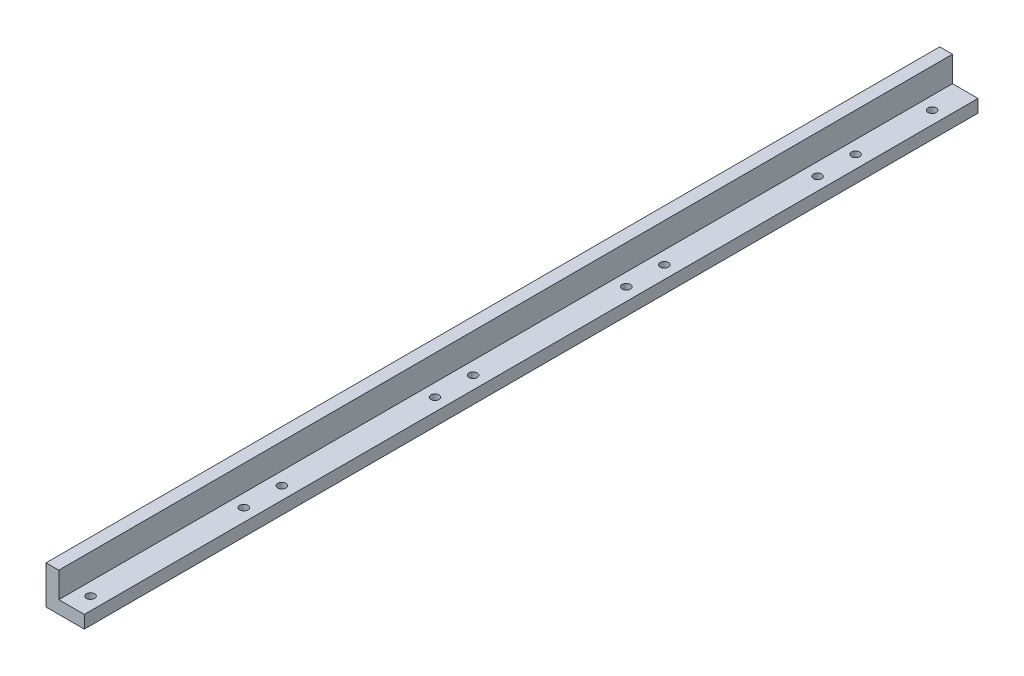
ISO-10303-21;
HEADER;
FILE_DESCRIPTION(('STEP AP214'),'2;1');
FILE_NAME('part.step','',(''),(''),'','','');
FILE_SCHEMA(('AUTOMOTIVE_DESIGN { 1 0 10303 214 1 1 1 1 }'));
ENDSEC;
DATA;
#1=APPLICATION_CONTEXT('core data for automotive mechanical design processes');
#2=APPLICATION_PROTOCOL_DEFINITION('international standard','automotive_design',2000,#1);
#3=PRODUCT_CONTEXT('',#1,'mechanical');
#4=PRODUCT('Part','Part','',(#3));
#5=PRODUCT_RELATED_PRODUCT_CATEGORY('part','',(#4));
#6=PRODUCT_DEFINITION_FORMATION('','',#4);
#7=PRODUCT_DEFINITION_CONTEXT('part definition',#1,'design');
#8=PRODUCT_DEFINITION('design','',#6,#7);
#9=PRODUCT_DEFINITION_SHAPE('','',#8);
#10=(LENGTH_UNIT() NAMED_UNIT(*) SI_UNIT(.MILLI.,.METRE.));
#11=(NAMED_UNIT(*) PLANE_ANGLE_UNIT() SI_UNIT($,.RADIAN.));
#12=(NAMED_UNIT(*) SI_UNIT($,.STERADIAN.) SOLID_ANGLE_UNIT());
#13=UNCERTAINTY_MEASURE_WITH_UNIT(LENGTH_MEASURE(1.E-05),#10,'distance_accuracy_value','');
#14=(GEOMETRIC_REPRESENTATION_CONTEXT(3) GLOBAL_UNCERTAINTY_ASSIGNED_CONTEXT((#13)) GLOBAL_UNIT_ASSIGNED_CONTEXT((#10,
#11,#12)) REPRESENTATION_CONTEXT('',''));
#15=CARTESIAN_POINT('',(0.,0.,0.));
#16=DIRECTION('',(0.,0.,1.));
#17=DIRECTION('',(1.,0.,0.));
#18=AXIS2_PLACEMENT_3D('',#15,#16,#17);
#19=CARTESIAN_POINT('',(15.,0.,350.));
#20=DIRECTION('',(0.,1.,0.));
#21=DIRECTION('',(-1.,0.,0.));
#22=AXIS2_PLACEMENT_3D('',#19,#20,#21);
#23=PLANE('',#22);
#24=CARTESIAN_POINT('',(10.0000000000001,0.,207.65));
#25=DIRECTION('',(0.,-1.,0.));
#26=DIRECTION('',(0.,0.,-1.));
#27=AXIS2_PLACEMENT_3D('',#24,#25,#26);
#28=CIRCLE('',#27,1.6);
#29=CARTESIAN_POINT('',(10.0000000000001,0.,206.05));
#30=VERTEX_POINT('',#29);
#31=EDGE_CURVE('E193',#30,#30,#28,.T.);
#32=ORIENTED_EDGE('',*,*,#31,.F.);
#33=EDGE_LOOP('',(#32));
#34=FACE_BOUND('',#33,.T.);
#35=CARTESIAN_POINT('',(10.,0.,267.65));
#36=DIRECTION('',(0.,-1.,0.));
#37=DIRECTION('',(0.,0.,-1.));
#38=AXIS2_PLACEMENT_3D('',#35,#36,#37);
#39=CIRCLE('',#38,1.6);
#40=CARTESIAN_POINT('',(10.,0.,266.05));
#41=VERTEX_POINT('',#40);
#42=EDGE_CURVE('E199',#41,#41,#39,.T.);
#43=ORIENTED_EDGE('',*,*,#42,.F.);
#44=EDGE_LOOP('',(#43));
#45=FACE_BOUND('',#44,.T.);
#46=DIRECTION('',(1.,0.,0.));
#47=VECTOR('',#46,1.);
#48=CARTESIAN_POINT('',(15.,0.,0.));
#49=LINE('',#48,#47);
#50=CARTESIAN_POINT('',(0.,0.,0.));
#51=VERTEX_POINT('',#50);
#52=CARTESIAN_POINT('',(15.,0.,0.));
#53=VERTEX_POINT('',#52);
#54=EDGE_CURVE('E122',#51,#53,#49,.T.);
#55=ORIENTED_EDGE('',*,*,#54,.T.);
#56=DIRECTION('',(0.,0.,-1.));
#57=VECTOR('',#56,1.);
#58=CARTESIAN_POINT('',(15.,0.,350.));
#59=LINE('',#58,#57);
#60=CARTESIAN_POINT('',(15.,0.,350.));
#61=VERTEX_POINT('',#60);
#62=EDGE_CURVE('E140',#61,#53,#59,.T.);
#63=ORIENTED_EDGE('',*,*,#62,.F.);
#64=DIRECTION('',(1.,0.,0.));
#65=VECTOR('',#64,1.);
#66=CARTESIAN_POINT('',(15.,0.,350.));
#67=LINE('',#66,#65);
#68=CARTESIAN_POINT('',(0.,0.,350.));
#69=VERTEX_POINT('',#68);
#70=EDGE_CURVE('E133',#69,#61,#67,.T.);
#71=ORIENTED_EDGE('',*,*,#70,.F.);
#72=DIRECTION('',(0.,0.,-1.));
#73=VECTOR('',#72,1.);
#74=CARTESIAN_POINT('',(0.,0.,350.));
#75=LINE('',#74,#73);
#76=EDGE_CURVE('E118',#69,#51,#75,.T.);
#77=ORIENTED_EDGE('',*,*,#76,.T.);
#78=EDGE_LOOP('',(#55,#63,#71,#77));
#79=FACE_BOUND('',#78,.T.);
#80=CARTESIAN_POINT('',(10.,0.,282.55));
#81=DIRECTION('',(0.,-1.,0.));
#82=DIRECTION('',(0.,0.,-1.));
#83=AXIS2_PLACEMENT_3D('',#80,#81,#82);
#84=CIRCLE('',#83,1.6);
#85=CARTESIAN_POINT('',(10.,0.,280.95));
#86=VERTEX_POINT('',#85);
#87=EDGE_CURVE('E208',#86,#86,#84,.T.);
#88=ORIENTED_EDGE('',*,*,#87,.F.);
#89=EDGE_LOOP('',(#88));
#90=FACE_BOUND('',#89,.T.);
#91=CARTESIAN_POINT('',(10.,0.,342.55));
#92=DIRECTION('',(0.,-1.,0.));
#93=DIRECTION('',(0.,0.,-1.));
#94=AXIS2_PLACEMENT_3D('',#91,#92,#93);
#95=CIRCLE('',#94,1.6);
#96=CARTESIAN_POINT('',(10.,0.,340.95));
#97=VERTEX_POINT('',#96);
#98=EDGE_CURVE('E202',#97,#97,#95,.T.);
#99=ORIENTED_EDGE('',*,*,#98,.F.);
#100=EDGE_LOOP('',(#99));
#101=FACE_BOUND('',#100,.T.);
#102=CARTESIAN_POINT('',(10.0000000000001,0.,192.75));
#103=DIRECTION('',(0.,-1.,0.));
#104=DIRECTION('',(0.,0.,-1.));
#105=AXIS2_PLACEMENT_3D('',#102,#103,#104);
#106=CIRCLE('',#105,1.6);
#107=CARTESIAN_POINT('',(10.0000000000001,0.,191.15));
#108=VERTEX_POINT('',#107);
#109=EDGE_CURVE('E145',#108,#108,#106,.T.);
#110=ORIENTED_EDGE('',*,*,#109,.F.);
#111=EDGE_LOOP('',(#110));
#112=FACE_BOUND('',#111,.T.);
#113=CARTESIAN_POINT('',(10.0000000000001,0.,117.85));
#114=DIRECTION('',(0.,-1.,0.));
#115=DIRECTION('',(0.,0.,-1.));
#116=AXIS2_PLACEMENT_3D('',#113,#114,#115);
#117=CIRCLE('',#116,1.6);
#118=CARTESIAN_POINT('',(10.0000000000001,0.,116.25));
#119=VERTEX_POINT('',#118);
#120=EDGE_CURVE('E151',#119,#119,#117,.T.);
#121=ORIENTED_EDGE('',*,*,#120,.F.);
#122=EDGE_LOOP('',(#121));
#123=FACE_BOUND('',#122,.T.);
#124=CARTESIAN_POINT('',(10.0000000000001,0.,132.75));
#125=DIRECTION('',(0.,-1.,0.));
#126=DIRECTION('',(0.,0.,-1.));
#127=AXIS2_PLACEMENT_3D('',#124,#125,#126);
#128=CIRCLE('',#127,1.6);
#129=CARTESIAN_POINT('',(10.0000000000001,0.,131.15));
#130=VERTEX_POINT('',#129);
#131=EDGE_CURVE('E157',#130,#130,#128,.T.);
#132=ORIENTED_EDGE('',*,*,#131,.F.);
#133=EDGE_LOOP('',(#132));
#134=FACE_BOUND('',#133,.T.);
#135=CARTESIAN_POINT('',(10.0000000000001,0.,57.85));
#136=DIRECTION('',(0.,-1.,0.));
#137=DIRECTION('',(0.,0.,-1.));
#138=AXIS2_PLACEMENT_3D('',#135,#136,#137);
#139=CIRCLE('',#138,1.6);
#140=CARTESIAN_POINT('',(10.0000000000001,0.,56.25));
#141=VERTEX_POINT('',#140);
#142=EDGE_CURVE('E11',#141,#141,#139,.T.);
#143=ORIENTED_EDGE('',*,*,#142,.F.);
#144=EDGE_LOOP('',(#143));
#145=FACE_BOUND('',#144,.T.);
#146=CARTESIAN_POINT('',(10.0000000000001,0.,12.95));
#147=DIRECTION('',(0.,-1.,0.));
#148=DIRECTION('',(0.,0.,-1.));
#149=AXIS2_PLACEMENT_3D('',#146,#147,#148);
#150=CIRCLE('',#149,1.59999999999999);
#151=CARTESIAN_POINT('',(10.0000000000001,0.,11.35));
#152=VERTEX_POINT('',#151);
#153=EDGE_CURVE('E176',#152,#152,#150,.T.);
#154=ORIENTED_EDGE('',*,*,#153,.F.);
#155=EDGE_LOOP('',(#154));
#156=FACE_BOUND('',#155,.T.);
#157=CARTESIAN_POINT('',(10.0000000000001,0.,42.95));
#158=DIRECTION('',(0.,-1.,0.));
#159=DIRECTION('',(0.,0.,-1.));
#160=AXIS2_PLACEMENT_3D('',#157,#158,#159);
#161=CIRCLE('',#160,1.59999999999999);
#162=CARTESIAN_POINT('',(10.0000000000001,0.,41.35));
#163=VERTEX_POINT('',#162);
#164=EDGE_CURVE('E179',#163,#163,#161,.T.);
#165=ORIENTED_EDGE('',*,*,#164,.F.);
#166=EDGE_LOOP('',(#165));
#167=FACE_BOUND('',#166,.T.);
#168=ADVANCED_FACE('F36',(#34,#45,#79,#90,#101,#112,#123,#134,#145,#156,#167),#23,.F.);
#169=CARTESIAN_POINT('',(10.0000000000001,0.,57.85));
#170=DIRECTION('',(0.,-1.,0.));
#171=DIRECTION('',(0.,0.,-1.));
#172=AXIS2_PLACEMENT_3D('',#169,#170,#171);
#173=CYLINDRICAL_SURFACE('',#172,1.6);
#174=CARTESIAN_POINT('',(10.0000000000001,5.,57.85));
#175=DIRECTION('',(0.,-1.,0.));
#176=DIRECTION('',(0.,0.,-1.));
#177=AXIS2_PLACEMENT_3D('',#174,#175,#176);
#178=CIRCLE('',#177,1.6);
#179=CARTESIAN_POINT('',(10.0000000000001,5.,56.25));
#180=VERTEX_POINT('',#179);
#181=EDGE_CURVE('E45',#180,#180,#178,.T.);
#182=ORIENTED_EDGE('',*,*,#181,.F.);
#183=EDGE_LOOP('',(#182));
#184=FACE_BOUND('',#183,.T.);
#185=ORIENTED_EDGE('',*,*,#142,.T.);
#186=EDGE_LOOP('',(#185));
#187=FACE_BOUND('',#186,.T.);
#188=ADVANCED_FACE('F38',(#184,#187),#173,.F.);
#189=CARTESIAN_POINT('',(10.0000000000001,0.,132.75));
#190=DIRECTION('',(0.,-1.,0.));
#191=DIRECTION('',(0.,0.,-1.));
#192=AXIS2_PLACEMENT_3D('',#189,#190,#191);
#193=CYLINDRICAL_SURFACE('',#192,1.6);
#194=CARTESIAN_POINT('',(10.0000000000001,5.,132.75));
#195=DIRECTION('',(0.,-1.,0.));
#196=DIRECTION('',(0.,0.,-1.));
#197=AXIS2_PLACEMENT_3D('',#194,#195,#196);
#198=CIRCLE('',#197,1.6);
#199=CARTESIAN_POINT('',(10.0000000000001,5.,131.15));
#200=VERTEX_POINT('',#199);
#201=EDGE_CURVE('E154',#200,#200,#198,.T.);
#202=ORIENTED_EDGE('',*,*,#201,.F.);
#203=EDGE_LOOP('',(#202));
#204=FACE_BOUND('',#203,.T.);
#205=ORIENTED_EDGE('',*,*,#131,.T.);
#206=EDGE_LOOP('',(#205));
#207=FACE_BOUND('',#206,.T.);
#208=ADVANCED_FACE('F166',(#204,#207),#193,.F.);
#209=CARTESIAN_POINT('',(10.0000000000001,0.,117.85));
#210=DIRECTION('',(0.,-1.,0.));
#211=DIRECTION('',(0.,0.,-1.));
#212=AXIS2_PLACEMENT_3D('',#209,#210,#211);
#213=CYLINDRICAL_SURFACE('',#212,1.6);
#214=CARTESIAN_POINT('',(10.0000000000001,5.,117.85));
#215=DIRECTION('',(0.,-1.,0.));
#216=DIRECTION('',(0.,0.,-1.));
#217=AXIS2_PLACEMENT_3D('',#214,#215,#216);
#218=CIRCLE('',#217,1.6);
#219=CARTESIAN_POINT('',(10.0000000000001,5.,116.25));
#220=VERTEX_POINT('',#219);
#221=EDGE_CURVE('E148',#220,#220,#218,.T.);
#222=ORIENTED_EDGE('',*,*,#221,.F.);
#223=EDGE_LOOP('',(#222));
#224=FACE_BOUND('',#223,.T.);
#225=ORIENTED_EDGE('',*,*,#120,.T.);
#226=EDGE_LOOP('',(#225));
#227=FACE_BOUND('',#226,.T.);
#228=ADVANCED_FACE('F246',(#224,#227),#213,.F.);
#229=CARTESIAN_POINT('',(10.0000000000001,0.,192.75));
#230=DIRECTION('',(0.,-1.,0.));
#231=DIRECTION('',(0.,0.,-1.));
#232=AXIS2_PLACEMENT_3D('',#229,#230,#231);
#233=CYLINDRICAL_SURFACE('',#232,1.6);
#234=CARTESIAN_POINT('',(10.0000000000001,5.,192.75));
#235=DIRECTION('',(0.,-1.,0.));
#236=DIRECTION('',(0.,0.,-1.));
#237=AXIS2_PLACEMENT_3D('',#234,#235,#236);
#238=CIRCLE('',#237,1.6);
#239=CARTESIAN_POINT('',(10.0000000000001,5.,191.15));
#240=VERTEX_POINT('',#239);
#241=EDGE_CURVE('E142',#240,#240,#238,.T.);
#242=ORIENTED_EDGE('',*,*,#241,.F.);
#243=EDGE_LOOP('',(#242));
#244=FACE_BOUND('',#243,.T.);
#245=ORIENTED_EDGE('',*,*,#109,.T.);
#246=EDGE_LOOP('',(#245));
#247=FACE_BOUND('',#246,.T.);
#248=ADVANCED_FACE('F242',(#244,#247),#233,.F.);
#249=CARTESIAN_POINT('',(15.,5.,350.));
#250=DIRECTION('',(-1.,0.,0.));
#251=DIRECTION('',(0.,0.,1.));
#252=AXIS2_PLACEMENT_3D('',#249,#250,#251);
#253=PLANE('',#252);
#254=DIRECTION('',(0.,1.,0.));
#255=VECTOR('',#254,1.);
#256=CARTESIAN_POINT('',(15.,5.,0.));
#257=LINE('',#256,#255);
#258=CARTESIAN_POINT('',(15.,5.,0.));
#259=VERTEX_POINT('',#258);
#260=EDGE_CURVE('E125',#53,#259,#257,.T.);
#261=ORIENTED_EDGE('',*,*,#260,.T.);
#262=DIRECTION('',(0.,0.,-1.));
#263=VECTOR('',#262,1.);
#264=CARTESIAN_POINT('',(15.,5.,350.));
#265=LINE('',#264,#263);
#266=CARTESIAN_POINT('',(15.,5.,350.));
#267=VERTEX_POINT('',#266);
#268=EDGE_CURVE('E137',#267,#259,#265,.T.);
#269=ORIENTED_EDGE('',*,*,#268,.F.);
#270=DIRECTION('',(0.,1.,0.));
#271=VECTOR('',#270,1.);
#272=CARTESIAN_POINT('',(15.,5.,350.));
#273=LINE('',#272,#271);
#274=EDGE_CURVE('E91',#61,#267,#273,.T.);
#275=ORIENTED_EDGE('',*,*,#274,.F.);
#276=ORIENTED_EDGE('',*,*,#62,.T.);
#277=EDGE_LOOP('',(#261,#269,#275,#276));
#278=FACE_BOUND('',#277,.T.);
#279=ADVANCED_FACE('F216',(#278),#253,.F.);
#280=CARTESIAN_POINT('',(5.,5.,350.));
#281=DIRECTION('',(0.,-1.,0.));
#282=DIRECTION('',(0.,0.,-1.));
#283=AXIS2_PLACEMENT_3D('',#280,#281,#282);
#284=PLANE('',#283);
#285=CARTESIAN_POINT('',(10.0000000000001,5.,42.95));
#286=DIRECTION('',(0.,-1.,0.));
#287=DIRECTION('',(0.,0.,-1.));
#288=AXIS2_PLACEMENT_3D('',#285,#286,#287);
#289=CIRCLE('',#288,1.59999999999999);
#290=CARTESIAN_POINT('',(10.0000000000001,5.,41.35));
#291=VERTEX_POINT('',#290);
#292=EDGE_CURVE('E181',#291,#291,#289,.T.);
#293=ORIENTED_EDGE('',*,*,#292,.T.);
#294=EDGE_LOOP('',(#293));
#295=FACE_BOUND('',#294,.T.);
#296=CARTESIAN_POINT('',(10.0000000000001,5.,12.95));
#297=DIRECTION('',(0.,-1.,0.));
#298=DIRECTION('',(0.,0.,-1.));
#299=AXIS2_PLACEMENT_3D('',#296,#297,#298);
#300=CIRCLE('',#299,1.59999999999999);
#301=CARTESIAN_POINT('',(10.0000000000001,5.,11.35));
#302=VERTEX_POINT('',#301);
#303=EDGE_CURVE('E187',#302,#302,#300,.T.);
#304=ORIENTED_EDGE('',*,*,#303,.T.);
#305=EDGE_LOOP('',(#304));
#306=FACE_BOUND('',#305,.T.);
#307=CARTESIAN_POINT('',(10.0000000000001,5.,207.65));
#308=DIRECTION('',(0.,-1.,0.));
#309=DIRECTION('',(0.,0.,-1.));
#310=AXIS2_PLACEMENT_3D('',#307,#308,#309);
#311=CIRCLE('',#310,1.6);
#312=CARTESIAN_POINT('',(10.0000000000001,5.,206.05));
#313=VERTEX_POINT('',#312);
#314=EDGE_CURVE('E190',#313,#313,#311,.T.);
#315=ORIENTED_EDGE('',*,*,#314,.T.);
#316=EDGE_LOOP('',(#315));
#317=FACE_BOUND('',#316,.T.);
#318=CARTESIAN_POINT('',(10.,5.,267.65));
#319=DIRECTION('',(0.,-1.,0.));
#320=DIRECTION('',(0.,0.,-1.));
#321=AXIS2_PLACEMENT_3D('',#318,#319,#320);
#322=CIRCLE('',#321,1.6);
#323=CARTESIAN_POINT('',(10.,5.,266.05));
#324=VERTEX_POINT('',#323);
#325=EDGE_CURVE('E196',#324,#324,#322,.T.);
#326=ORIENTED_EDGE('',*,*,#325,.T.);
#327=EDGE_LOOP('',(#326));
#328=FACE_BOUND('',#327,.T.);
#329=CARTESIAN_POINT('',(10.,5.,342.55));
#330=DIRECTION('',(0.,-1.,0.));
#331=DIRECTION('',(0.,0.,-1.));
#332=AXIS2_PLACEMENT_3D('',#329,#330,#331);
#333=CIRCLE('',#332,1.6);
#334=CARTESIAN_POINT('',(10.,5.,340.95));
#335=VERTEX_POINT('',#334);
#336=EDGE_CURVE('E205',#335,#335,#333,.T.);
#337=ORIENTED_EDGE('',*,*,#336,.T.);
#338=EDGE_LOOP('',(#337));
#339=FACE_BOUND('',#338,.T.);
#340=CARTESIAN_POINT('',(10.,5.,282.55));
#341=DIRECTION('',(0.,-1.,0.));
#342=DIRECTION('',(0.,0.,-1.));
#343=AXIS2_PLACEMENT_3D('',#340,#341,#342);
#344=CIRCLE('',#343,1.6);
#345=CARTESIAN_POINT('',(10.,5.,280.95));
#346=VERTEX_POINT('',#345);
#347=EDGE_CURVE('E126',#346,#346,#344,.T.);
#348=ORIENTED_EDGE('',*,*,#347,.T.);
#349=EDGE_LOOP('',(#348));
#350=FACE_BOUND('',#349,.T.);
#351=DIRECTION('',(-1.,0.,0.));
#352=VECTOR('',#351,1.);
#353=CARTESIAN_POINT('',(5.,5.,0.));
#354=LINE('',#353,#352);
#355=CARTESIAN_POINT('',(5.,5.,0.));
#356=VERTEX_POINT('',#355);
#357=EDGE_CURVE('E128',#259,#356,#354,.T.);
#358=ORIENTED_EDGE('',*,*,#357,.T.);
#359=DIRECTION('',(0.,0.,-1.));
#360=VECTOR('',#359,1.);
#361=CARTESIAN_POINT('',(5.,5.,350.));
#362=LINE('',#361,#360);
#363=CARTESIAN_POINT('',(5.,5.,350.));
#364=VERTEX_POINT('',#363);
#365=EDGE_CURVE('E113',#364,#356,#362,.T.);
#366=ORIENTED_EDGE('',*,*,#365,.F.);
#367=DIRECTION('',(-1.,0.,0.));
#368=VECTOR('',#367,1.);
#369=CARTESIAN_POINT('',(5.,5.,350.));
#370=LINE('',#369,#368);
#371=EDGE_CURVE('E104',#267,#364,#370,.T.);
#372=ORIENTED_EDGE('',*,*,#371,.F.);
#373=ORIENTED_EDGE('',*,*,#268,.T.);
#374=EDGE_LOOP('',(#358,#366,#372,#373));
#375=FACE_BOUND('',#374,.T.);
#376=ORIENTED_EDGE('',*,*,#241,.T.);
#377=EDGE_LOOP('',(#376));
#378=FACE_BOUND('',#377,.T.);
#379=ORIENTED_EDGE('',*,*,#221,.T.);
#380=EDGE_LOOP('',(#379));
#381=FACE_BOUND('',#380,.T.);
#382=ORIENTED_EDGE('',*,*,#201,.T.);
#383=EDGE_LOOP('',(#382));
#384=FACE_BOUND('',#383,.T.);
#385=ORIENTED_EDGE('',*,*,#181,.T.);
#386=EDGE_LOOP('',(#385));
#387=FACE_BOUND('',#386,.T.);
#388=ADVANCED_FACE('F162',(#295,#306,#317,#328,#339,#350,#375,#378,#381,#384,#387),#284,.F.);
#389=CARTESIAN_POINT('',(5.,15.,350.));
#390=DIRECTION('',(-1.,0.,0.));
#391=DIRECTION('',(0.,-1.,0.));
#392=AXIS2_PLACEMENT_3D('',#389,#390,#391);
#393=PLANE('',#392);
#394=DIRECTION('',(0.,1.,0.));
#395=VECTOR('',#394,1.);
#396=CARTESIAN_POINT('',(5.,15.,0.));
#397=LINE('',#396,#395);
#398=CARTESIAN_POINT('',(5.,15.,0.));
#399=VERTEX_POINT('',#398);
#400=EDGE_CURVE('E112',#356,#399,#397,.T.);
#401=ORIENTED_EDGE('',*,*,#400,.T.);
#402=DIRECTION('',(0.,0.,-1.));
#403=VECTOR('',#402,1.);
#404=CARTESIAN_POINT('',(5.,15.,350.));
#405=LINE('',#404,#403);
#406=CARTESIAN_POINT('',(5.,15.,350.));
#407=VERTEX_POINT('',#406);
#408=EDGE_CURVE('E109',#407,#399,#405,.T.);
#409=ORIENTED_EDGE('',*,*,#408,.F.);
#410=DIRECTION('',(0.,1.,0.));
#411=VECTOR('',#410,1.);
#412=CARTESIAN_POINT('',(5.,15.,350.));
#413=LINE('',#412,#411);
#414=EDGE_CURVE('E98',#364,#407,#413,.T.);
#415=ORIENTED_EDGE('',*,*,#414,.F.);
#416=ORIENTED_EDGE('',*,*,#365,.T.);
#417=EDGE_LOOP('',(#401,#409,#415,#416));
#418=FACE_BOUND('',#417,.T.);
#419=ADVANCED_FACE('F110',(#418),#393,.F.);
#420=CARTESIAN_POINT('',(0.,15.,350.));
#421=DIRECTION('',(0.,-1.,0.));
#422=DIRECTION('',(0.,0.,-1.));
#423=AXIS2_PLACEMENT_3D('',#420,#421,#422);
#424=PLANE('',#423);
#425=DIRECTION('',(-1.,0.,0.));
#426=VECTOR('',#425,1.);
#427=CARTESIAN_POINT('',(0.,15.,0.));
#428=LINE('',#427,#426);
#429=CARTESIAN_POINT('',(0.,15.,0.));
#430=VERTEX_POINT('',#429);
#431=EDGE_CURVE('E76',#399,#430,#428,.T.);
#432=ORIENTED_EDGE('',*,*,#431,.T.);
#433=DIRECTION('',(0.,0.,-1.));
#434=VECTOR('',#433,1.);
#435=CARTESIAN_POINT('',(0.,15.,350.));
#436=LINE('',#435,#434);
#437=CARTESIAN_POINT('',(0.,15.,350.));
#438=VERTEX_POINT('',#437);
#439=EDGE_CURVE('E114',#438,#430,#436,.T.);
#440=ORIENTED_EDGE('',*,*,#439,.F.);
#441=DIRECTION('',(-1.,0.,0.));
#442=VECTOR('',#441,1.);
#443=CARTESIAN_POINT('',(0.,15.,350.));
#444=LINE('',#443,#442);
#445=EDGE_CURVE('E102',#407,#438,#444,.T.);
#446=ORIENTED_EDGE('',*,*,#445,.F.);
#447=ORIENTED_EDGE('',*,*,#408,.T.);
#448=EDGE_LOOP('',(#432,#440,#446,#447));
#449=FACE_BOUND('',#448,.T.);
#450=ADVANCED_FACE('F116',(#449),#424,.F.);
#451=CARTESIAN_POINT('',(0.,0.,350.));
#452=DIRECTION('',(1.,0.,0.));
#453=DIRECTION('',(0.,0.,-1.));
#454=AXIS2_PLACEMENT_3D('',#451,#452,#453);
#455=PLANE('',#454);
#456=DIRECTION('',(0.,-1.,0.));
#457=VECTOR('',#456,1.);
#458=CARTESIAN_POINT('',(0.,0.,0.));
#459=LINE('',#458,#457);
#460=EDGE_CURVE('E82',#430,#51,#459,.T.);
#461=ORIENTED_EDGE('',*,*,#460,.T.);
#462=ORIENTED_EDGE('',*,*,#76,.F.);
#463=DIRECTION('',(0.,-1.,0.));
#464=VECTOR('',#463,1.);
#465=CARTESIAN_POINT('',(0.,0.,350.));
#466=LINE('',#465,#464);
#467=EDGE_CURVE('E53',#438,#69,#466,.T.);
#468=ORIENTED_EDGE('',*,*,#467,.F.);
#469=ORIENTED_EDGE('',*,*,#439,.T.);
#470=EDGE_LOOP('',(#461,#462,#468,#469));
#471=FACE_BOUND('',#470,.T.);
#472=ADVANCED_FACE('F225',(#471),#455,.F.);
#473=CARTESIAN_POINT('',(0.,0.,350.));
#474=DIRECTION('',(0.,0.,-1.));
#475=DIRECTION('',(-1.,0.,0.));
#476=AXIS2_PLACEMENT_3D('',#473,#474,#475);
#477=PLANE('',#476);
#478=ORIENTED_EDGE('',*,*,#70,.T.);
#479=ORIENTED_EDGE('',*,*,#274,.T.);
#480=ORIENTED_EDGE('',*,*,#371,.T.);
#481=ORIENTED_EDGE('',*,*,#414,.T.);
#482=ORIENTED_EDGE('',*,*,#445,.T.);
#483=ORIENTED_EDGE('',*,*,#467,.T.);
#484=EDGE_LOOP('',(#478,#479,#480,#481,#482,#483));
#485=FACE_BOUND('',#484,.T.);
#486=ADVANCED_FACE('F100',(#485),#477,.F.);
#487=CARTESIAN_POINT('',(0.,0.,0.));
#488=DIRECTION('',(0.,0.,-1.));
#489=DIRECTION('',(-1.,0.,0.));
#490=AXIS2_PLACEMENT_3D('',#487,#488,#489);
#491=PLANE('',#490);
#492=ORIENTED_EDGE('',*,*,#54,.F.);
#493=ORIENTED_EDGE('',*,*,#460,.F.);
#494=ORIENTED_EDGE('',*,*,#431,.F.);
#495=ORIENTED_EDGE('',*,*,#400,.F.);
#496=ORIENTED_EDGE('',*,*,#357,.F.);
#497=ORIENTED_EDGE('',*,*,#260,.F.);
#498=EDGE_LOOP('',(#492,#493,#494,#495,#496,#497));
#499=FACE_BOUND('',#498,.T.);
#500=ADVANCED_FACE('F222',(#499),#491,.T.);
#501=CARTESIAN_POINT('',(10.,0.,282.55));
#502=DIRECTION('',(0.,-1.,0.));
#503=DIRECTION('',(0.,0.,-1.));
#504=AXIS2_PLACEMENT_3D('',#501,#502,#503);
#505=CYLINDRICAL_SURFACE('',#504,1.6);
#506=ORIENTED_EDGE('',*,*,#347,.F.);
#507=EDGE_LOOP('',(#506));
#508=FACE_BOUND('',#507,.T.);
#509=ORIENTED_EDGE('',*,*,#87,.T.);
#510=EDGE_LOOP('',(#509));
#511=FACE_BOUND('',#510,.T.);
#512=ADVANCED_FACE('F304',(#508,#511),#505,.F.);
#513=CARTESIAN_POINT('',(10.,0.,342.55));
#514=DIRECTION('',(0.,-1.,0.));
#515=DIRECTION('',(0.,0.,-1.));
#516=AXIS2_PLACEMENT_3D('',#513,#514,#515);
#517=CYLINDRICAL_SURFACE('',#516,1.6);
#518=ORIENTED_EDGE('',*,*,#336,.F.);
#519=EDGE_LOOP('',(#518));
#520=FACE_BOUND('',#519,.T.);
#521=ORIENTED_EDGE('',*,*,#98,.T.);
#522=EDGE_LOOP('',(#521));
#523=FACE_BOUND('',#522,.T.);
#524=ADVANCED_FACE('F313',(#520,#523),#517,.F.);
#525=CARTESIAN_POINT('',(10.,0.,267.65));
#526=DIRECTION('',(0.,-1.,0.));
#527=DIRECTION('',(0.,0.,-1.));
#528=AXIS2_PLACEMENT_3D('',#525,#526,#527);
#529=CYLINDRICAL_SURFACE('',#528,1.6);
#530=ORIENTED_EDGE('',*,*,#325,.F.);
#531=EDGE_LOOP('',(#530));
#532=FACE_BOUND('',#531,.T.);
#533=ORIENTED_EDGE('',*,*,#42,.T.);
#534=EDGE_LOOP('',(#533));
#535=FACE_BOUND('',#534,.T.);
#536=ADVANCED_FACE('F323',(#532,#535),#529,.F.);
#537=CARTESIAN_POINT('',(10.0000000000001,0.,207.65));
#538=DIRECTION('',(0.,-1.,0.));
#539=DIRECTION('',(0.,0.,-1.));
#540=AXIS2_PLACEMENT_3D('',#537,#538,#539);
#541=CYLINDRICAL_SURFACE('',#540,1.6);
#542=ORIENTED_EDGE('',*,*,#314,.F.);
#543=EDGE_LOOP('',(#542));
#544=FACE_BOUND('',#543,.T.);
#545=ORIENTED_EDGE('',*,*,#31,.T.);
#546=EDGE_LOOP('',(#545));
#547=FACE_BOUND('',#546,.T.);
#548=ADVANCED_FACE('F333',(#544,#547),#541,.F.);
#549=CARTESIAN_POINT('',(10.0000000000001,0.,12.95));
#550=DIRECTION('',(0.,-1.,0.));
#551=DIRECTION('',(0.,0.,-1.));
#552=AXIS2_PLACEMENT_3D('',#549,#550,#551);
#553=CYLINDRICAL_SURFACE('',#552,1.59999999999999);
#554=ORIENTED_EDGE('',*,*,#303,.F.);
#555=EDGE_LOOP('',(#554));
#556=FACE_BOUND('',#555,.T.);
#557=ORIENTED_EDGE('',*,*,#153,.T.);
#558=EDGE_LOOP('',(#557));
#559=FACE_BOUND('',#558,.T.);
#560=ADVANCED_FACE('F343',(#556,#559),#553,.F.);
#561=CARTESIAN_POINT('',(10.0000000000001,0.,42.95));
#562=DIRECTION('',(0.,-1.,0.));
#563=DIRECTION('',(0.,0.,-1.));
#564=AXIS2_PLACEMENT_3D('',#561,#562,#563);
#565=CYLINDRICAL_SURFACE('',#564,1.59999999999999);
#566=ORIENTED_EDGE('',*,*,#292,.F.);
#567=EDGE_LOOP('',(#566));
#568=FACE_BOUND('',#567,.T.);
#569=ORIENTED_EDGE('',*,*,#164,.T.);
#570=EDGE_LOOP('',(#569));
#571=FACE_BOUND('',#570,.T.);
#572=ADVANCED_FACE('F353',(#568,#571),#565,.F.);
#573=CLOSED_SHELL('',(#168,#188,#208,#228,#248,#279,#388,#419,#450,#472,#486,#500,#512,#524,
#536,#548,#560,#572));
#574=MANIFOLD_SOLID_BREP('B2',#573);
#575=ADVANCED_BREP_SHAPE_REPRESENTATION('',(#18,#574),#14);
#576=SHAPE_DEFINITION_REPRESENTATION(#9,#575);
ENDSEC;
END-ISO-10303-21;
